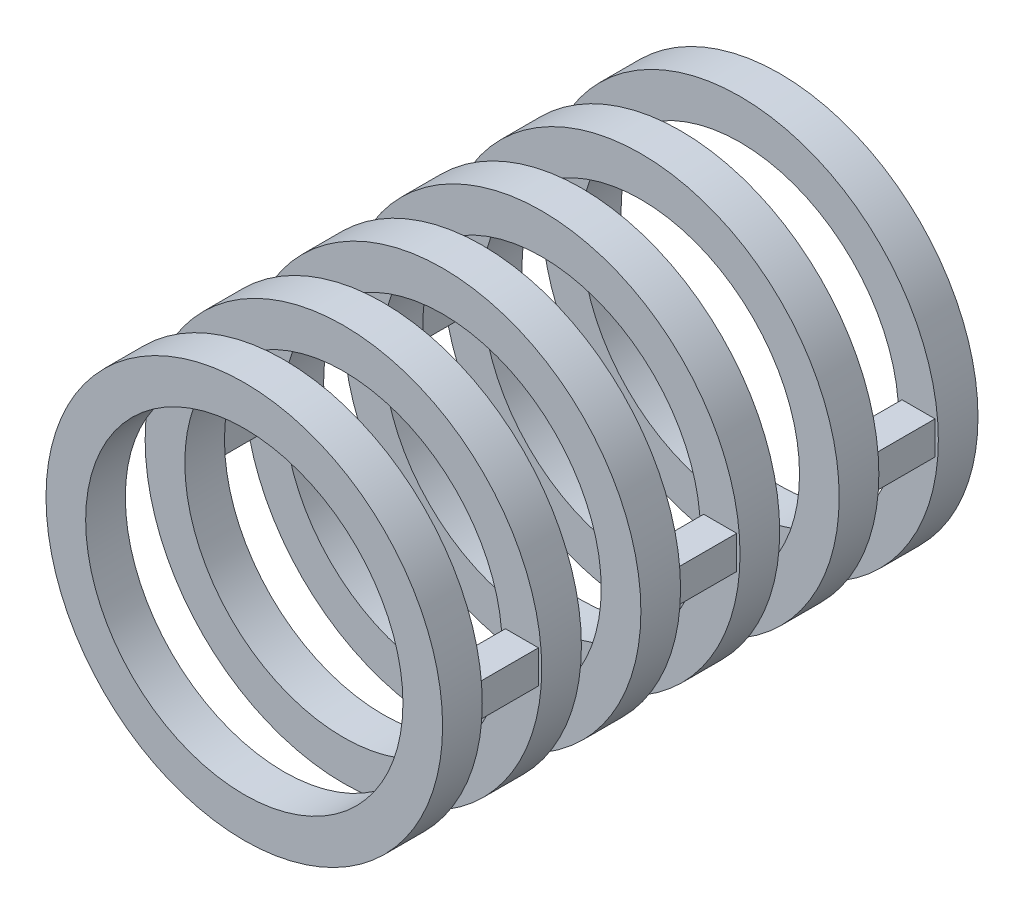
ISO-10303-21;
HEADER;
FILE_DESCRIPTION(('STEP AP214'),'2;1');
FILE_NAME('part.step','',(''),(''),'','','');
FILE_SCHEMA(('AUTOMOTIVE_DESIGN { 1 0 10303 214 1 1 1 1 }'));
ENDSEC;
DATA;
#1=APPLICATION_CONTEXT('core data for automotive mechanical design processes');
#2=APPLICATION_PROTOCOL_DEFINITION('international standard','automotive_design',2000,#1);
#3=PRODUCT_CONTEXT('',#1,'mechanical');
#4=PRODUCT('Part','Part','',(#3));
#5=PRODUCT_RELATED_PRODUCT_CATEGORY('part','',(#4));
#6=PRODUCT_DEFINITION_FORMATION('','',#4);
#7=PRODUCT_DEFINITION_CONTEXT('part definition',#1,'design');
#8=PRODUCT_DEFINITION('design','',#6,#7);
#9=PRODUCT_DEFINITION_SHAPE('','',#8);
#10=(LENGTH_UNIT() NAMED_UNIT(*) SI_UNIT(.MILLI.,.METRE.));
#11=(NAMED_UNIT(*) PLANE_ANGLE_UNIT() SI_UNIT($,.RADIAN.));
#12=(NAMED_UNIT(*) SI_UNIT($,.STERADIAN.) SOLID_ANGLE_UNIT());
#13=UNCERTAINTY_MEASURE_WITH_UNIT(LENGTH_MEASURE(1.E-05),#10,'distance_accuracy_value','');
#14=(GEOMETRIC_REPRESENTATION_CONTEXT(3) GLOBAL_UNCERTAINTY_ASSIGNED_CONTEXT((#13)) GLOBAL_UNIT_ASSIGNED_CONTEXT((#10,
#11,#12)) REPRESENTATION_CONTEXT('',''));
#15=CARTESIAN_POINT('',(0.,0.,0.));
#16=DIRECTION('',(0.,0.,1.));
#17=DIRECTION('',(1.,0.,0.));
#18=AXIS2_PLACEMENT_3D('',#15,#16,#17);
#19=CARTESIAN_POINT('',(0.,0.,15.));
#20=DIRECTION('',(0.,0.,1.));
#21=DIRECTION('',(1.,0.,0.));
#22=AXIS2_PLACEMENT_3D('',#19,#20,#21);
#23=PLANE('',#22);
#24=CARTESIAN_POINT('',(0.,0.,15.));
#25=DIRECTION('',(0.,0.,1.));
#26=DIRECTION('',(1.,0.,0.));
#27=AXIS2_PLACEMENT_3D('',#24,#25,#26);
#28=CIRCLE('',#27,4.8);
#29=CARTESIAN_POINT('',(4.8,0.,15.));
#30=VERTEX_POINT('',#29);
#31=EDGE_CURVE('E391',#30,#30,#28,.T.);
#32=ORIENTED_EDGE('',*,*,#31,.T.);
#33=EDGE_LOOP('',(#32));
#34=FACE_BOUND('',#33,.T.);
#35=CARTESIAN_POINT('',(0.,0.,15.));
#36=DIRECTION('',(0.,0.,1.));
#37=DIRECTION('',(1.,0.,0.));
#38=AXIS2_PLACEMENT_3D('',#35,#36,#37);
#39=CIRCLE('',#38,6.);
#40=CARTESIAN_POINT('',(6.,0.,15.));
#41=VERTEX_POINT('',#40);
#42=EDGE_CURVE('E43',#41,#41,#39,.T.);
#43=ORIENTED_EDGE('',*,*,#42,.F.);
#44=EDGE_LOOP('',(#43));
#45=FACE_BOUND('',#44,.T.);
#46=DIRECTION('',(0.,-1.,0.));
#47=VECTOR('',#46,1.);
#48=CARTESIAN_POINT('',(4.9,0.5,15.));
#49=LINE('',#48,#47);
#50=CARTESIAN_POINT('',(4.9,0.5,15.));
#51=VERTEX_POINT('',#50);
#52=CARTESIAN_POINT('',(4.9,-0.5,15.));
#53=VERTEX_POINT('',#52);
#54=EDGE_CURVE('E54',#51,#53,#49,.T.);
#55=ORIENTED_EDGE('',*,*,#54,.T.);
#56=DIRECTION('',(1.,0.,0.));
#57=VECTOR('',#56,1.);
#58=CARTESIAN_POINT('',(4.9,-0.5,15.));
#59=LINE('',#58,#57);
#60=CARTESIAN_POINT('',(5.9,-0.5,15.));
#61=VERTEX_POINT('',#60);
#62=EDGE_CURVE('E58',#53,#61,#59,.T.);
#63=ORIENTED_EDGE('',*,*,#62,.T.);
#64=DIRECTION('',(0.,1.,0.));
#65=VECTOR('',#64,1.);
#66=CARTESIAN_POINT('',(5.9,-0.5,15.));
#67=LINE('',#66,#65);
#68=CARTESIAN_POINT('',(5.9,0.5,15.));
#69=VERTEX_POINT('',#68);
#70=EDGE_CURVE('E365',#61,#69,#67,.T.);
#71=ORIENTED_EDGE('',*,*,#70,.T.);
#72=DIRECTION('',(-1.,0.,0.));
#73=VECTOR('',#72,1.);
#74=CARTESIAN_POINT('',(5.9,0.5,15.));
#75=LINE('',#74,#73);
#76=EDGE_CURVE('E367',#69,#51,#75,.T.);
#77=ORIENTED_EDGE('',*,*,#76,.T.);
#78=EDGE_LOOP('',(#55,#63,#71,#77));
#79=FACE_BOUND('',#78,.T.);
#80=ADVANCED_FACE('F39',(#34,#45,#79),#23,.F.);
#81=CARTESIAN_POINT('',(0.,0.,16.2));
#82=DIRECTION('',(0.,0.,1.));
#83=DIRECTION('',(1.,0.,0.));
#84=AXIS2_PLACEMENT_3D('',#81,#82,#83);
#85=PLANE('',#84);
#86=CARTESIAN_POINT('',(0.,0.,16.2));
#87=DIRECTION('',(0.,0.,1.));
#88=DIRECTION('',(1.,0.,0.));
#89=AXIS2_PLACEMENT_3D('',#86,#87,#88);
#90=CIRCLE('',#89,6.);
#91=CARTESIAN_POINT('',(6.,0.,16.2));
#92=VERTEX_POINT('',#91);
#93=EDGE_CURVE('E11',#92,#92,#90,.T.);
#94=ORIENTED_EDGE('',*,*,#93,.T.);
#95=EDGE_LOOP('',(#94));
#96=FACE_BOUND('',#95,.T.);
#97=CARTESIAN_POINT('',(0.,0.,16.2));
#98=DIRECTION('',(0.,0.,1.));
#99=DIRECTION('',(1.,0.,0.));
#100=AXIS2_PLACEMENT_3D('',#97,#98,#99);
#101=CIRCLE('',#100,4.8);
#102=CARTESIAN_POINT('',(4.8,0.,16.2));
#103=VERTEX_POINT('',#102);
#104=EDGE_CURVE('E392',#103,#103,#101,.T.);
#105=ORIENTED_EDGE('',*,*,#104,.F.);
#106=EDGE_LOOP('',(#105));
#107=FACE_BOUND('',#106,.T.);
#108=ADVANCED_FACE('F413',(#96,#107),#85,.T.);
#109=CARTESIAN_POINT('',(0.,0.,16.2));
#110=DIRECTION('',(0.,0.,-1.));
#111=DIRECTION('',(-1.,0.,0.));
#112=AXIS2_PLACEMENT_3D('',#109,#110,#111);
#113=CYLINDRICAL_SURFACE('',#112,6.);
#114=ORIENTED_EDGE('',*,*,#93,.F.);
#115=EDGE_LOOP('',(#114));
#116=FACE_BOUND('',#115,.T.);
#117=ORIENTED_EDGE('',*,*,#42,.T.);
#118=EDGE_LOOP('',(#117));
#119=FACE_BOUND('',#118,.T.);
#120=ADVANCED_FACE('F41',(#116,#119),#113,.T.);
#121=CARTESIAN_POINT('',(0.,0.,16.2));
#122=DIRECTION('',(0.,0.,-1.));
#123=DIRECTION('',(-1.,0.,0.));
#124=AXIS2_PLACEMENT_3D('',#121,#122,#123);
#125=CYLINDRICAL_SURFACE('',#124,4.8);
#126=ORIENTED_EDGE('',*,*,#104,.T.);
#127=EDGE_LOOP('',(#126));
#128=FACE_BOUND('',#127,.T.);
#129=ORIENTED_EDGE('',*,*,#31,.F.);
#130=EDGE_LOOP('',(#129));
#131=FACE_BOUND('',#130,.T.);
#132=ADVANCED_FACE('F400',(#128,#131),#125,.F.);
#133=CARTESIAN_POINT('',(4.9,0.5,15.));
#134=DIRECTION('',(1.,0.,0.));
#135=DIRECTION('',(0.,0.,-1.));
#136=AXIS2_PLACEMENT_3D('',#133,#134,#135);
#137=PLANE('',#136);
#138=DIRECTION('',(0.,-1.,0.));
#139=VECTOR('',#138,1.);
#140=CARTESIAN_POINT('',(4.9,0.5,13.2));
#141=LINE('',#140,#139);
#142=CARTESIAN_POINT('',(4.9,0.5,13.2));
#143=VERTEX_POINT('',#142);
#144=CARTESIAN_POINT('',(4.9,-0.5,13.2));
#145=VERTEX_POINT('',#144);
#146=EDGE_CURVE('E359',#143,#145,#141,.T.);
#147=ORIENTED_EDGE('',*,*,#146,.T.);
#148=DIRECTION('',(0.,0.,-1.));
#149=VECTOR('',#148,1.);
#150=CARTESIAN_POINT('',(4.9,-0.5,15.));
#151=LINE('',#150,#149);
#152=EDGE_CURVE('E388',#53,#145,#151,.T.);
#153=ORIENTED_EDGE('',*,*,#152,.F.);
#154=ORIENTED_EDGE('',*,*,#54,.F.);
#155=DIRECTION('',(0.,0.,-1.));
#156=VECTOR('',#155,1.);
#157=CARTESIAN_POINT('',(4.9,0.5,15.));
#158=LINE('',#157,#156);
#159=EDGE_CURVE('E369',#51,#143,#158,.T.);
#160=ORIENTED_EDGE('',*,*,#159,.T.);
#161=EDGE_LOOP('',(#147,#153,#154,#160));
#162=FACE_BOUND('',#161,.T.);
#163=ADVANCED_FACE('F402',(#162),#137,.F.);
#164=CARTESIAN_POINT('',(4.9,-0.5,15.));
#165=DIRECTION('',(0.,1.,0.));
#166=DIRECTION('',(0.,0.,1.));
#167=AXIS2_PLACEMENT_3D('',#164,#165,#166);
#168=PLANE('',#167);
#169=DIRECTION('',(1.,0.,0.));
#170=VECTOR('',#169,1.);
#171=CARTESIAN_POINT('',(4.9,-0.5,13.2));
#172=LINE('',#171,#170);
#173=CARTESIAN_POINT('',(5.9,-0.5,13.2));
#174=VERTEX_POINT('',#173);
#175=EDGE_CURVE('E372',#145,#174,#172,.T.);
#176=ORIENTED_EDGE('',*,*,#175,.T.);
#177=DIRECTION('',(0.,0.,-1.));
#178=VECTOR('',#177,1.);
#179=CARTESIAN_POINT('',(5.9,-0.5,15.));
#180=LINE('',#179,#178);
#181=EDGE_CURVE('E385',#61,#174,#180,.T.);
#182=ORIENTED_EDGE('',*,*,#181,.F.);
#183=ORIENTED_EDGE('',*,*,#62,.F.);
#184=ORIENTED_EDGE('',*,*,#152,.T.);
#185=EDGE_LOOP('',(#176,#182,#183,#184));
#186=FACE_BOUND('',#185,.T.);
#187=ADVANCED_FACE('F410',(#186),#168,.F.);
#188=CARTESIAN_POINT('',(5.9,-0.5,15.));
#189=DIRECTION('',(-1.,0.,0.));
#190=DIRECTION('',(0.,0.,1.));
#191=AXIS2_PLACEMENT_3D('',#188,#189,#190);
#192=PLANE('',#191);
#193=DIRECTION('',(0.,1.,0.));
#194=VECTOR('',#193,1.);
#195=CARTESIAN_POINT('',(5.9,-0.5,13.2));
#196=LINE('',#195,#194);
#197=CARTESIAN_POINT('',(5.9,0.5,13.2));
#198=VERTEX_POINT('',#197);
#199=EDGE_CURVE('E375',#174,#198,#196,.T.);
#200=ORIENTED_EDGE('',*,*,#199,.T.);
#201=DIRECTION('',(0.,0.,-1.));
#202=VECTOR('',#201,1.);
#203=CARTESIAN_POINT('',(5.9,0.5,15.));
#204=LINE('',#203,#202);
#205=EDGE_CURVE('E382',#69,#198,#204,.T.);
#206=ORIENTED_EDGE('',*,*,#205,.F.);
#207=ORIENTED_EDGE('',*,*,#70,.F.);
#208=ORIENTED_EDGE('',*,*,#181,.T.);
#209=EDGE_LOOP('',(#200,#206,#207,#208));
#210=FACE_BOUND('',#209,.T.);
#211=ADVANCED_FACE('F797',(#210),#192,.F.);
#212=CARTESIAN_POINT('',(5.9,0.5,15.));
#213=DIRECTION('',(0.,-1.,0.));
#214=DIRECTION('',(0.,0.,-1.));
#215=AXIS2_PLACEMENT_3D('',#212,#213,#214);
#216=PLANE('',#215);
#217=DIRECTION('',(-1.,0.,0.));
#218=VECTOR('',#217,1.);
#219=CARTESIAN_POINT('',(5.9,0.5,13.2));
#220=LINE('',#219,#218);
#221=EDGE_CURVE('E363',#198,#143,#220,.T.);
#222=ORIENTED_EDGE('',*,*,#221,.T.);
#223=ORIENTED_EDGE('',*,*,#159,.F.);
#224=ORIENTED_EDGE('',*,*,#76,.F.);
#225=ORIENTED_EDGE('',*,*,#205,.T.);
#226=EDGE_LOOP('',(#222,#223,#224,#225));
#227=FACE_BOUND('',#226,.T.);
#228=ADVANCED_FACE('F453',(#227),#216,.F.);
#229=CARTESIAN_POINT('',(0.,0.,13.2));
#230=DIRECTION('',(0.,0.,1.));
#231=DIRECTION('',(1.,0.,0.));
#232=AXIS2_PLACEMENT_3D('',#229,#230,#231);
#233=PLANE('',#232);
#234=CARTESIAN_POINT('',(0.,0.,13.2));
#235=DIRECTION('',(0.,0.,1.));
#236=DIRECTION('',(1.,0.,0.));
#237=AXIS2_PLACEMENT_3D('',#234,#235,#236);
#238=CIRCLE('',#237,4.8);
#239=CARTESIAN_POINT('',(4.8,0.,13.2));
#240=VERTEX_POINT('',#239);
#241=EDGE_CURVE('E350',#240,#240,#238,.T.);
#242=ORIENTED_EDGE('',*,*,#241,.F.);
#243=EDGE_LOOP('',(#242));
#244=FACE_BOUND('',#243,.T.);
#245=CARTESIAN_POINT('',(0.,0.,13.2));
#246=DIRECTION('',(0.,0.,1.));
#247=DIRECTION('',(1.,0.,0.));
#248=AXIS2_PLACEMENT_3D('',#245,#246,#247);
#249=CIRCLE('',#248,6.);
#250=CARTESIAN_POINT('',(6.,0.,13.2));
#251=VERTEX_POINT('',#250);
#252=EDGE_CURVE('E356',#251,#251,#249,.T.);
#253=ORIENTED_EDGE('',*,*,#252,.T.);
#254=EDGE_LOOP('',(#253));
#255=FACE_BOUND('',#254,.T.);
#256=ORIENTED_EDGE('',*,*,#146,.F.);
#257=ORIENTED_EDGE('',*,*,#221,.F.);
#258=ORIENTED_EDGE('',*,*,#199,.F.);
#259=ORIENTED_EDGE('',*,*,#175,.F.);
#260=EDGE_LOOP('',(#256,#257,#258,#259));
#261=FACE_BOUND('',#260,.T.);
#262=ADVANCED_FACE('F447',(#244,#255,#261),#233,.T.);
#263=CARTESIAN_POINT('',(0.,0.,12.));
#264=DIRECTION('',(0.,0.,1.));
#265=DIRECTION('',(1.,0.,0.));
#266=AXIS2_PLACEMENT_3D('',#263,#264,#265);
#267=PLANE('',#266);
#268=CARTESIAN_POINT('',(0.,0.,12.));
#269=DIRECTION('',(0.,0.,1.));
#270=DIRECTION('',(1.,0.,0.));
#271=AXIS2_PLACEMENT_3D('',#268,#269,#270);
#272=CIRCLE('',#271,4.8);
#273=CARTESIAN_POINT('',(4.8,0.,12.));
#274=VERTEX_POINT('',#273);
#275=EDGE_CURVE('E349',#274,#274,#272,.T.);
#276=ORIENTED_EDGE('',*,*,#275,.T.);
#277=EDGE_LOOP('',(#276));
#278=FACE_BOUND('',#277,.T.);
#279=CARTESIAN_POINT('',(0.,0.,12.));
#280=DIRECTION('',(0.,0.,1.));
#281=DIRECTION('',(1.,0.,0.));
#282=AXIS2_PLACEMENT_3D('',#279,#280,#281);
#283=CIRCLE('',#282,6.);
#284=CARTESIAN_POINT('',(6.,0.,12.));
#285=VERTEX_POINT('',#284);
#286=EDGE_CURVE('E353',#285,#285,#283,.T.);
#287=ORIENTED_EDGE('',*,*,#286,.F.);
#288=EDGE_LOOP('',(#287));
#289=FACE_BOUND('',#288,.T.);
#290=DIRECTION('',(0.,1.,0.));
#291=VECTOR('',#290,1.);
#292=CARTESIAN_POINT('',(-4.9,-0.499999999999999,12.));
#293=LINE('',#292,#291);
#294=CARTESIAN_POINT('',(-4.9,-0.499999999999999,12.));
#295=VERTEX_POINT('',#294);
#296=CARTESIAN_POINT('',(-4.9,0.500000000000001,12.));
#297=VERTEX_POINT('',#296);
#298=EDGE_CURVE('E318',#295,#297,#293,.T.);
#299=ORIENTED_EDGE('',*,*,#298,.T.);
#300=DIRECTION('',(-1.,0.,0.));
#301=VECTOR('',#300,1.);
#302=CARTESIAN_POINT('',(-4.9,0.500000000000001,12.));
#303=LINE('',#302,#301);
#304=CARTESIAN_POINT('',(-5.9,0.500000000000001,12.));
#305=VERTEX_POINT('',#304);
#306=EDGE_CURVE('E320',#297,#305,#303,.T.);
#307=ORIENTED_EDGE('',*,*,#306,.T.);
#308=DIRECTION('',(0.,-1.,0.));
#309=VECTOR('',#308,1.);
#310=CARTESIAN_POINT('',(-5.9,0.500000000000001,12.));
#311=LINE('',#310,#309);
#312=CARTESIAN_POINT('',(-5.9,-0.499999999999999,12.));
#313=VERTEX_POINT('',#312);
#314=EDGE_CURVE('E323',#305,#313,#311,.T.);
#315=ORIENTED_EDGE('',*,*,#314,.T.);
#316=DIRECTION('',(1.,0.,0.));
#317=VECTOR('',#316,1.);
#318=CARTESIAN_POINT('',(-5.9,-0.499999999999999,12.));
#319=LINE('',#318,#317);
#320=EDGE_CURVE('E325',#313,#295,#319,.T.);
#321=ORIENTED_EDGE('',*,*,#320,.T.);
#322=EDGE_LOOP('',(#299,#307,#315,#321));
#323=FACE_BOUND('',#322,.T.);
#324=ADVANCED_FACE('F452',(#278,#289,#323),#267,.F.);
#325=CARTESIAN_POINT('',(0.,0.,13.2));
#326=DIRECTION('',(0.,0.,-1.));
#327=DIRECTION('',(-1.,0.,0.));
#328=AXIS2_PLACEMENT_3D('',#325,#326,#327);
#329=CYLINDRICAL_SURFACE('',#328,6.);
#330=ORIENTED_EDGE('',*,*,#252,.F.);
#331=EDGE_LOOP('',(#330));
#332=FACE_BOUND('',#331,.T.);
#333=ORIENTED_EDGE('',*,*,#286,.T.);
#334=EDGE_LOOP('',(#333));
#335=FACE_BOUND('',#334,.T.);
#336=ADVANCED_FACE('F464',(#332,#335),#329,.T.);
#337=CARTESIAN_POINT('',(0.,0.,13.2));
#338=DIRECTION('',(0.,0.,-1.));
#339=DIRECTION('',(-1.,0.,0.));
#340=AXIS2_PLACEMENT_3D('',#337,#338,#339);
#341=CYLINDRICAL_SURFACE('',#340,4.8);
#342=ORIENTED_EDGE('',*,*,#241,.T.);
#343=EDGE_LOOP('',(#342));
#344=FACE_BOUND('',#343,.T.);
#345=ORIENTED_EDGE('',*,*,#275,.F.);
#346=EDGE_LOOP('',(#345));
#347=FACE_BOUND('',#346,.T.);
#348=ADVANCED_FACE('F474',(#344,#347),#341,.F.);
#349=CARTESIAN_POINT('',(-4.9,-0.499999999999999,12.));
#350=DIRECTION('',(-1.,0.,0.));
#351=DIRECTION('',(0.,0.,1.));
#352=AXIS2_PLACEMENT_3D('',#349,#350,#351);
#353=PLANE('',#352);
#354=DIRECTION('',(0.,1.,0.));
#355=VECTOR('',#354,1.);
#356=CARTESIAN_POINT('',(-4.9,-0.499999999999999,10.2));
#357=LINE('',#356,#355);
#358=CARTESIAN_POINT('',(-4.9,-0.499999999999999,10.2));
#359=VERTEX_POINT('',#358);
#360=CARTESIAN_POINT('',(-4.9,0.500000000000001,10.2));
#361=VERTEX_POINT('',#360);
#362=EDGE_CURVE('E315',#359,#361,#357,.T.);
#363=ORIENTED_EDGE('',*,*,#362,.T.);
#364=DIRECTION('',(0.,0.,-1.));
#365=VECTOR('',#364,1.);
#366=CARTESIAN_POINT('',(-4.9,0.500000000000001,12.));
#367=LINE('',#366,#365);
#368=EDGE_CURVE('E346',#297,#361,#367,.T.);
#369=ORIENTED_EDGE('',*,*,#368,.F.);
#370=ORIENTED_EDGE('',*,*,#298,.F.);
#371=DIRECTION('',(0.,0.,-1.));
#372=VECTOR('',#371,1.);
#373=CARTESIAN_POINT('',(-4.9,-0.499999999999999,12.));
#374=LINE('',#373,#372);
#375=EDGE_CURVE('E327',#295,#359,#374,.T.);
#376=ORIENTED_EDGE('',*,*,#375,.T.);
#377=EDGE_LOOP('',(#363,#369,#370,#376));
#378=FACE_BOUND('',#377,.T.);
#379=ADVANCED_FACE('F483',(#378),#353,.F.);
#380=CARTESIAN_POINT('',(-4.9,0.500000000000001,12.));
#381=DIRECTION('',(0.,-1.,0.));
#382=DIRECTION('',(1.,0.,0.));
#383=AXIS2_PLACEMENT_3D('',#380,#381,#382);
#384=PLANE('',#383);
#385=DIRECTION('',(-1.,0.,0.));
#386=VECTOR('',#385,1.);
#387=CARTESIAN_POINT('',(-4.9,0.500000000000001,10.2));
#388=LINE('',#387,#386);
#389=CARTESIAN_POINT('',(-5.9,0.500000000000001,10.2));
#390=VERTEX_POINT('',#389);
#391=EDGE_CURVE('E330',#361,#390,#388,.T.);
#392=ORIENTED_EDGE('',*,*,#391,.T.);
#393=DIRECTION('',(0.,0.,-1.));
#394=VECTOR('',#393,1.);
#395=CARTESIAN_POINT('',(-5.9,0.500000000000001,12.));
#396=LINE('',#395,#394);
#397=EDGE_CURVE('E343',#305,#390,#396,.T.);
#398=ORIENTED_EDGE('',*,*,#397,.F.);
#399=ORIENTED_EDGE('',*,*,#306,.F.);
#400=ORIENTED_EDGE('',*,*,#368,.T.);
#401=EDGE_LOOP('',(#392,#398,#399,#400));
#402=FACE_BOUND('',#401,.T.);
#403=ADVANCED_FACE('F492',(#402),#384,.F.);
#404=CARTESIAN_POINT('',(-5.9,0.500000000000001,12.));
#405=DIRECTION('',(1.,0.,0.));
#406=DIRECTION('',(0.,0.,-1.));
#407=AXIS2_PLACEMENT_3D('',#404,#405,#406);
#408=PLANE('',#407);
#409=DIRECTION('',(0.,-1.,0.));
#410=VECTOR('',#409,1.);
#411=CARTESIAN_POINT('',(-5.9,0.500000000000001,10.2));
#412=LINE('',#411,#410);
#413=CARTESIAN_POINT('',(-5.9,-0.499999999999999,10.2));
#414=VERTEX_POINT('',#413);
#415=EDGE_CURVE('E333',#390,#414,#412,.T.);
#416=ORIENTED_EDGE('',*,*,#415,.T.);
#417=DIRECTION('',(0.,0.,-1.));
#418=VECTOR('',#417,1.);
#419=CARTESIAN_POINT('',(-5.9,-0.499999999999999,12.));
#420=LINE('',#419,#418);
#421=EDGE_CURVE('E340',#313,#414,#420,.T.);
#422=ORIENTED_EDGE('',*,*,#421,.F.);
#423=ORIENTED_EDGE('',*,*,#314,.F.);
#424=ORIENTED_EDGE('',*,*,#397,.T.);
#425=EDGE_LOOP('',(#416,#422,#423,#424));
#426=FACE_BOUND('',#425,.T.);
#427=ADVANCED_FACE('F501',(#426),#408,.F.);
#428=CARTESIAN_POINT('',(-5.9,-0.499999999999999,12.));
#429=DIRECTION('',(0.,1.,0.));
#430=DIRECTION('',(-1.,0.,0.));
#431=AXIS2_PLACEMENT_3D('',#428,#429,#430);
#432=PLANE('',#431);
#433=DIRECTION('',(1.,0.,0.));
#434=VECTOR('',#433,1.);
#435=CARTESIAN_POINT('',(-5.9,-0.499999999999999,10.2));
#436=LINE('',#435,#434);
#437=EDGE_CURVE('E321',#414,#359,#436,.T.);
#438=ORIENTED_EDGE('',*,*,#437,.T.);
#439=ORIENTED_EDGE('',*,*,#375,.F.);
#440=ORIENTED_EDGE('',*,*,#320,.F.);
#441=ORIENTED_EDGE('',*,*,#421,.T.);
#442=EDGE_LOOP('',(#438,#439,#440,#441));
#443=FACE_BOUND('',#442,.T.);
#444=ADVANCED_FACE('F510',(#443),#432,.F.);
#445=CARTESIAN_POINT('',(0.,0.,10.2));
#446=DIRECTION('',(0.,0.,1.));
#447=DIRECTION('',(1.,0.,0.));
#448=AXIS2_PLACEMENT_3D('',#445,#446,#447);
#449=PLANE('',#448);
#450=CARTESIAN_POINT('',(0.,0.,10.2));
#451=DIRECTION('',(0.,0.,1.));
#452=DIRECTION('',(1.,0.,0.));
#453=AXIS2_PLACEMENT_3D('',#450,#451,#452);
#454=CIRCLE('',#453,4.8);
#455=CARTESIAN_POINT('',(4.8,0.,10.2));
#456=VERTEX_POINT('',#455);
#457=EDGE_CURVE('E306',#456,#456,#454,.T.);
#458=ORIENTED_EDGE('',*,*,#457,.F.);
#459=EDGE_LOOP('',(#458));
#460=FACE_BOUND('',#459,.T.);
#461=CARTESIAN_POINT('',(0.,0.,10.2));
#462=DIRECTION('',(0.,0.,1.));
#463=DIRECTION('',(1.,0.,0.));
#464=AXIS2_PLACEMENT_3D('',#461,#462,#463);
#465=CIRCLE('',#464,6.);
#466=CARTESIAN_POINT('',(6.,0.,10.2));
#467=VERTEX_POINT('',#466);
#468=EDGE_CURVE('E312',#467,#467,#465,.T.);
#469=ORIENTED_EDGE('',*,*,#468,.T.);
#470=EDGE_LOOP('',(#469));
#471=FACE_BOUND('',#470,.T.);
#472=ORIENTED_EDGE('',*,*,#362,.F.);
#473=ORIENTED_EDGE('',*,*,#437,.F.);
#474=ORIENTED_EDGE('',*,*,#415,.F.);
#475=ORIENTED_EDGE('',*,*,#391,.F.);
#476=EDGE_LOOP('',(#472,#473,#474,#475));
#477=FACE_BOUND('',#476,.T.);
#478=ADVANCED_FACE('F519',(#460,#471,#477),#449,.T.);
#479=CARTESIAN_POINT('',(0.,0.,9.));
#480=DIRECTION('',(0.,0.,1.));
#481=DIRECTION('',(1.,0.,0.));
#482=AXIS2_PLACEMENT_3D('',#479,#480,#481);
#483=PLANE('',#482);
#484=CARTESIAN_POINT('',(0.,0.,9.));
#485=DIRECTION('',(0.,0.,1.));
#486=DIRECTION('',(1.,0.,0.));
#487=AXIS2_PLACEMENT_3D('',#484,#485,#486);
#488=CIRCLE('',#487,4.8);
#489=CARTESIAN_POINT('',(4.8,0.,9.));
#490=VERTEX_POINT('',#489);
#491=EDGE_CURVE('E305',#490,#490,#488,.T.);
#492=ORIENTED_EDGE('',*,*,#491,.T.);
#493=EDGE_LOOP('',(#492));
#494=FACE_BOUND('',#493,.T.);
#495=CARTESIAN_POINT('',(0.,0.,9.));
#496=DIRECTION('',(0.,0.,1.));
#497=DIRECTION('',(1.,0.,0.));
#498=AXIS2_PLACEMENT_3D('',#495,#496,#497);
#499=CIRCLE('',#498,6.);
#500=CARTESIAN_POINT('',(6.,0.,9.));
#501=VERTEX_POINT('',#500);
#502=EDGE_CURVE('E309',#501,#501,#499,.T.);
#503=ORIENTED_EDGE('',*,*,#502,.F.);
#504=EDGE_LOOP('',(#503));
#505=FACE_BOUND('',#504,.T.);
#506=DIRECTION('',(0.,-1.,0.));
#507=VECTOR('',#506,1.);
#508=CARTESIAN_POINT('',(4.9,0.5,9.));
#509=LINE('',#508,#507);
#510=CARTESIAN_POINT('',(4.9,0.5,9.));
#511=VERTEX_POINT('',#510);
#512=CARTESIAN_POINT('',(4.9,-0.5,9.));
#513=VERTEX_POINT('',#512);
#514=EDGE_CURVE('E274',#511,#513,#509,.T.);
#515=ORIENTED_EDGE('',*,*,#514,.T.);
#516=DIRECTION('',(1.,0.,0.));
#517=VECTOR('',#516,1.);
#518=CARTESIAN_POINT('',(4.9,-0.5,9.));
#519=LINE('',#518,#517);
#520=CARTESIAN_POINT('',(5.9,-0.5,9.));
#521=VERTEX_POINT('',#520);
#522=EDGE_CURVE('E276',#513,#521,#519,.T.);
#523=ORIENTED_EDGE('',*,*,#522,.T.);
#524=DIRECTION('',(0.,1.,0.));
#525=VECTOR('',#524,1.);
#526=CARTESIAN_POINT('',(5.9,-0.5,9.));
#527=LINE('',#526,#525);
#528=CARTESIAN_POINT('',(5.9,0.5,9.));
#529=VERTEX_POINT('',#528);
#530=EDGE_CURVE('E279',#521,#529,#527,.T.);
#531=ORIENTED_EDGE('',*,*,#530,.T.);
#532=DIRECTION('',(-1.,0.,0.));
#533=VECTOR('',#532,1.);
#534=CARTESIAN_POINT('',(5.9,0.5,9.));
#535=LINE('',#534,#533);
#536=EDGE_CURVE('E281',#529,#511,#535,.T.);
#537=ORIENTED_EDGE('',*,*,#536,.T.);
#538=EDGE_LOOP('',(#515,#523,#531,#537));
#539=FACE_BOUND('',#538,.T.);
#540=ADVANCED_FACE('F528',(#494,#505,#539),#483,.F.);
#541=CARTESIAN_POINT('',(0.,0.,10.2));
#542=DIRECTION('',(0.,0.,-1.));
#543=DIRECTION('',(-1.,0.,0.));
#544=AXIS2_PLACEMENT_3D('',#541,#542,#543);
#545=CYLINDRICAL_SURFACE('',#544,6.);
#546=ORIENTED_EDGE('',*,*,#468,.F.);
#547=EDGE_LOOP('',(#546));
#548=FACE_BOUND('',#547,.T.);
#549=ORIENTED_EDGE('',*,*,#502,.T.);
#550=EDGE_LOOP('',(#549));
#551=FACE_BOUND('',#550,.T.);
#552=ADVANCED_FACE('F537',(#548,#551),#545,.T.);
#553=CARTESIAN_POINT('',(0.,0.,10.2));
#554=DIRECTION('',(0.,0.,-1.));
#555=DIRECTION('',(-1.,0.,0.));
#556=AXIS2_PLACEMENT_3D('',#553,#554,#555);
#557=CYLINDRICAL_SURFACE('',#556,4.8);
#558=ORIENTED_EDGE('',*,*,#457,.T.);
#559=EDGE_LOOP('',(#558));
#560=FACE_BOUND('',#559,.T.);
#561=ORIENTED_EDGE('',*,*,#491,.F.);
#562=EDGE_LOOP('',(#561));
#563=FACE_BOUND('',#562,.T.);
#564=ADVANCED_FACE('F546',(#560,#563),#557,.F.);
#565=CARTESIAN_POINT('',(4.9,0.5,9.));
#566=DIRECTION('',(1.,0.,0.));
#567=DIRECTION('',(0.,0.,-1.));
#568=AXIS2_PLACEMENT_3D('',#565,#566,#567);
#569=PLANE('',#568);
#570=DIRECTION('',(0.,-1.,0.));
#571=VECTOR('',#570,1.);
#572=CARTESIAN_POINT('',(4.9,0.5,7.2));
#573=LINE('',#572,#571);
#574=CARTESIAN_POINT('',(4.9,0.5,7.2));
#575=VERTEX_POINT('',#574);
#576=CARTESIAN_POINT('',(4.9,-0.5,7.2));
#577=VERTEX_POINT('',#576);
#578=EDGE_CURVE('E271',#575,#577,#573,.T.);
#579=ORIENTED_EDGE('',*,*,#578,.T.);
#580=DIRECTION('',(0.,0.,-1.));
#581=VECTOR('',#580,1.);
#582=CARTESIAN_POINT('',(4.9,-0.5,9.));
#583=LINE('',#582,#581);
#584=EDGE_CURVE('E302',#513,#577,#583,.T.);
#585=ORIENTED_EDGE('',*,*,#584,.F.);
#586=ORIENTED_EDGE('',*,*,#514,.F.);
#587=DIRECTION('',(0.,0.,-1.));
#588=VECTOR('',#587,1.);
#589=CARTESIAN_POINT('',(4.9,0.5,9.));
#590=LINE('',#589,#588);
#591=EDGE_CURVE('E283',#511,#575,#590,.T.);
#592=ORIENTED_EDGE('',*,*,#591,.T.);
#593=EDGE_LOOP('',(#579,#585,#586,#592));
#594=FACE_BOUND('',#593,.T.);
#595=ADVANCED_FACE('F556',(#594),#569,.F.);
#596=CARTESIAN_POINT('',(4.9,-0.5,9.));
#597=DIRECTION('',(0.,1.,0.));
#598=DIRECTION('',(0.,0.,1.));
#599=AXIS2_PLACEMENT_3D('',#596,#597,#598);
#600=PLANE('',#599);
#601=DIRECTION('',(1.,0.,0.));
#602=VECTOR('',#601,1.);
#603=CARTESIAN_POINT('',(4.9,-0.5,7.2));
#604=LINE('',#603,#602);
#605=CARTESIAN_POINT('',(5.9,-0.5,7.2));
#606=VERTEX_POINT('',#605);
#607=EDGE_CURVE('E286',#577,#606,#604,.T.);
#608=ORIENTED_EDGE('',*,*,#607,.T.);
#609=DIRECTION('',(0.,0.,-1.));
#610=VECTOR('',#609,1.);
#611=CARTESIAN_POINT('',(5.9,-0.5,9.));
#612=LINE('',#611,#610);
#613=EDGE_CURVE('E299',#521,#606,#612,.T.);
#614=ORIENTED_EDGE('',*,*,#613,.F.);
#615=ORIENTED_EDGE('',*,*,#522,.F.);
#616=ORIENTED_EDGE('',*,*,#584,.T.);
#617=EDGE_LOOP('',(#608,#614,#615,#616));
#618=FACE_BOUND('',#617,.T.);
#619=ADVANCED_FACE('F566',(#618),#600,.F.);
#620=CARTESIAN_POINT('',(5.9,-0.5,9.));
#621=DIRECTION('',(-1.,0.,0.));
#622=DIRECTION('',(0.,0.,1.));
#623=AXIS2_PLACEMENT_3D('',#620,#621,#622);
#624=PLANE('',#623);
#625=DIRECTION('',(0.,1.,0.));
#626=VECTOR('',#625,1.);
#627=CARTESIAN_POINT('',(5.9,-0.5,7.2));
#628=LINE('',#627,#626);
#629=CARTESIAN_POINT('',(5.9,0.5,7.2));
#630=VERTEX_POINT('',#629);
#631=EDGE_CURVE('E289',#606,#630,#628,.T.);
#632=ORIENTED_EDGE('',*,*,#631,.T.);
#633=DIRECTION('',(0.,0.,-1.));
#634=VECTOR('',#633,1.);
#635=CARTESIAN_POINT('',(5.9,0.5,9.));
#636=LINE('',#635,#634);
#637=EDGE_CURVE('E296',#529,#630,#636,.T.);
#638=ORIENTED_EDGE('',*,*,#637,.F.);
#639=ORIENTED_EDGE('',*,*,#530,.F.);
#640=ORIENTED_EDGE('',*,*,#613,.T.);
#641=EDGE_LOOP('',(#632,#638,#639,#640));
#642=FACE_BOUND('',#641,.T.);
#643=ADVANCED_FACE('F576',(#642),#624,.F.);
#644=CARTESIAN_POINT('',(5.9,0.5,9.));
#645=DIRECTION('',(0.,-1.,0.));
#646=DIRECTION('',(0.,0.,-1.));
#647=AXIS2_PLACEMENT_3D('',#644,#645,#646);
#648=PLANE('',#647);
#649=DIRECTION('',(-1.,0.,0.));
#650=VECTOR('',#649,1.);
#651=CARTESIAN_POINT('',(5.9,0.5,7.2));
#652=LINE('',#651,#650);
#653=EDGE_CURVE('E277',#630,#575,#652,.T.);
#654=ORIENTED_EDGE('',*,*,#653,.T.);
#655=ORIENTED_EDGE('',*,*,#591,.F.);
#656=ORIENTED_EDGE('',*,*,#536,.F.);
#657=ORIENTED_EDGE('',*,*,#637,.T.);
#658=EDGE_LOOP('',(#654,#655,#656,#657));
#659=FACE_BOUND('',#658,.T.);
#660=ADVANCED_FACE('F586',(#659),#648,.F.);
#661=CARTESIAN_POINT('',(0.,0.,7.2));
#662=DIRECTION('',(0.,0.,1.));
#663=DIRECTION('',(1.,0.,0.));
#664=AXIS2_PLACEMENT_3D('',#661,#662,#663);
#665=PLANE('',#664);
#666=CARTESIAN_POINT('',(0.,0.,7.2));
#667=DIRECTION('',(0.,0.,1.));
#668=DIRECTION('',(1.,0.,0.));
#669=AXIS2_PLACEMENT_3D('',#666,#667,#668);
#670=CIRCLE('',#669,4.8);
#671=CARTESIAN_POINT('',(4.8,0.,7.2));
#672=VERTEX_POINT('',#671);
#673=EDGE_CURVE('E262',#672,#672,#670,.T.);
#674=ORIENTED_EDGE('',*,*,#673,.F.);
#675=EDGE_LOOP('',(#674));
#676=FACE_BOUND('',#675,.T.);
#677=CARTESIAN_POINT('',(0.,0.,7.2));
#678=DIRECTION('',(0.,0.,1.));
#679=DIRECTION('',(1.,0.,0.));
#680=AXIS2_PLACEMENT_3D('',#677,#678,#679);
#681=CIRCLE('',#680,6.);
#682=CARTESIAN_POINT('',(6.,0.,7.2));
#683=VERTEX_POINT('',#682);
#684=EDGE_CURVE('E268',#683,#683,#681,.T.);
#685=ORIENTED_EDGE('',*,*,#684,.T.);
#686=EDGE_LOOP('',(#685));
#687=FACE_BOUND('',#686,.T.);
#688=ORIENTED_EDGE('',*,*,#578,.F.);
#689=ORIENTED_EDGE('',*,*,#653,.F.);
#690=ORIENTED_EDGE('',*,*,#631,.F.);
#691=ORIENTED_EDGE('',*,*,#607,.F.);
#692=EDGE_LOOP('',(#688,#689,#690,#691));
#693=FACE_BOUND('',#692,.T.);
#694=ADVANCED_FACE('F596',(#676,#687,#693),#665,.T.);
#695=CARTESIAN_POINT('',(0.,0.,6.));
#696=DIRECTION('',(0.,0.,1.));
#697=DIRECTION('',(1.,0.,0.));
#698=AXIS2_PLACEMENT_3D('',#695,#696,#697);
#699=PLANE('',#698);
#700=CARTESIAN_POINT('',(0.,0.,6.));
#701=DIRECTION('',(0.,0.,1.));
#702=DIRECTION('',(1.,0.,0.));
#703=AXIS2_PLACEMENT_3D('',#700,#701,#702);
#704=CIRCLE('',#703,4.8);
#705=CARTESIAN_POINT('',(4.8,0.,6.));
#706=VERTEX_POINT('',#705);
#707=EDGE_CURVE('E261',#706,#706,#704,.T.);
#708=ORIENTED_EDGE('',*,*,#707,.T.);
#709=EDGE_LOOP('',(#708));
#710=FACE_BOUND('',#709,.T.);
#711=CARTESIAN_POINT('',(0.,0.,6.));
#712=DIRECTION('',(0.,0.,1.));
#713=DIRECTION('',(1.,0.,0.));
#714=AXIS2_PLACEMENT_3D('',#711,#712,#713);
#715=CIRCLE('',#714,6.);
#716=CARTESIAN_POINT('',(6.,0.,6.));
#717=VERTEX_POINT('',#716);
#718=EDGE_CURVE('E265',#717,#717,#715,.T.);
#719=ORIENTED_EDGE('',*,*,#718,.F.);
#720=EDGE_LOOP('',(#719));
#721=FACE_BOUND('',#720,.T.);
#722=DIRECTION('',(0.,1.,0.));
#723=VECTOR('',#722,1.);
#724=CARTESIAN_POINT('',(-4.9,-0.499999999999999,6.));
#725=LINE('',#724,#723);
#726=CARTESIAN_POINT('',(-4.9,-0.499999999999999,6.));
#727=VERTEX_POINT('',#726);
#728=CARTESIAN_POINT('',(-4.9,0.500000000000001,6.));
#729=VERTEX_POINT('',#728);
#730=EDGE_CURVE('E230',#727,#729,#725,.T.);
#731=ORIENTED_EDGE('',*,*,#730,.T.);
#732=DIRECTION('',(-1.,0.,0.));
#733=VECTOR('',#732,1.);
#734=CARTESIAN_POINT('',(-4.9,0.500000000000001,6.));
#735=LINE('',#734,#733);
#736=CARTESIAN_POINT('',(-5.9,0.500000000000001,6.));
#737=VERTEX_POINT('',#736);
#738=EDGE_CURVE('E232',#729,#737,#735,.T.);
#739=ORIENTED_EDGE('',*,*,#738,.T.);
#740=DIRECTION('',(0.,-1.,0.));
#741=VECTOR('',#740,1.);
#742=CARTESIAN_POINT('',(-5.9,0.500000000000001,6.));
#743=LINE('',#742,#741);
#744=CARTESIAN_POINT('',(-5.9,-0.499999999999999,6.));
#745=VERTEX_POINT('',#744);
#746=EDGE_CURVE('E235',#737,#745,#743,.T.);
#747=ORIENTED_EDGE('',*,*,#746,.T.);
#748=DIRECTION('',(1.,0.,0.));
#749=VECTOR('',#748,1.);
#750=CARTESIAN_POINT('',(-5.9,-0.499999999999999,6.));
#751=LINE('',#750,#749);
#752=EDGE_CURVE('E237',#745,#727,#751,.T.);
#753=ORIENTED_EDGE('',*,*,#752,.T.);
#754=EDGE_LOOP('',(#731,#739,#747,#753));
#755=FACE_BOUND('',#754,.T.);
#756=ADVANCED_FACE('F606',(#710,#721,#755),#699,.F.);
#757=CARTESIAN_POINT('',(0.,0.,7.2));
#758=DIRECTION('',(0.,0.,-1.));
#759=DIRECTION('',(-1.,0.,0.));
#760=AXIS2_PLACEMENT_3D('',#757,#758,#759);
#761=CYLINDRICAL_SURFACE('',#760,6.);
#762=ORIENTED_EDGE('',*,*,#684,.F.);
#763=EDGE_LOOP('',(#762));
#764=FACE_BOUND('',#763,.T.);
#765=ORIENTED_EDGE('',*,*,#718,.T.);
#766=EDGE_LOOP('',(#765));
#767=FACE_BOUND('',#766,.T.);
#768=ADVANCED_FACE('F616',(#764,#767),#761,.T.);
#769=CARTESIAN_POINT('',(0.,0.,7.2));
#770=DIRECTION('',(0.,0.,-1.));
#771=DIRECTION('',(-1.,0.,0.));
#772=AXIS2_PLACEMENT_3D('',#769,#770,#771);
#773=CYLINDRICAL_SURFACE('',#772,4.8);
#774=ORIENTED_EDGE('',*,*,#673,.T.);
#775=EDGE_LOOP('',(#774));
#776=FACE_BOUND('',#775,.T.);
#777=ORIENTED_EDGE('',*,*,#707,.F.);
#778=EDGE_LOOP('',(#777));
#779=FACE_BOUND('',#778,.T.);
#780=ADVANCED_FACE('F626',(#776,#779),#773,.F.);
#781=CARTESIAN_POINT('',(-4.9,-0.499999999999999,6.));
#782=DIRECTION('',(-1.,0.,0.));
#783=DIRECTION('',(0.,0.,1.));
#784=AXIS2_PLACEMENT_3D('',#781,#782,#783);
#785=PLANE('',#784);
#786=DIRECTION('',(0.,1.,0.));
#787=VECTOR('',#786,1.);
#788=CARTESIAN_POINT('',(-4.9,-0.499999999999999,4.2));
#789=LINE('',#788,#787);
#790=CARTESIAN_POINT('',(-4.9,-0.499999999999999,4.2));
#791=VERTEX_POINT('',#790);
#792=CARTESIAN_POINT('',(-4.9,0.500000000000001,4.2));
#793=VERTEX_POINT('',#792);
#794=EDGE_CURVE('E227',#791,#793,#789,.T.);
#795=ORIENTED_EDGE('',*,*,#794,.T.);
#796=DIRECTION('',(0.,0.,-1.));
#797=VECTOR('',#796,1.);
#798=CARTESIAN_POINT('',(-4.9,0.500000000000001,6.));
#799=LINE('',#798,#797);
#800=EDGE_CURVE('E258',#729,#793,#799,.T.);
#801=ORIENTED_EDGE('',*,*,#800,.F.);
#802=ORIENTED_EDGE('',*,*,#730,.F.);
#803=DIRECTION('',(0.,0.,-1.));
#804=VECTOR('',#803,1.);
#805=CARTESIAN_POINT('',(-4.9,-0.499999999999999,6.));
#806=LINE('',#805,#804);
#807=EDGE_CURVE('E239',#727,#791,#806,.T.);
#808=ORIENTED_EDGE('',*,*,#807,.T.);
#809=EDGE_LOOP('',(#795,#801,#802,#808));
#810=FACE_BOUND('',#809,.T.);
#811=ADVANCED_FACE('F635',(#810),#785,.F.);
#812=CARTESIAN_POINT('',(-4.9,0.500000000000001,6.));
#813=DIRECTION('',(0.,-1.,0.));
#814=DIRECTION('',(1.,0.,0.));
#815=AXIS2_PLACEMENT_3D('',#812,#813,#814);
#816=PLANE('',#815);
#817=DIRECTION('',(-1.,0.,0.));
#818=VECTOR('',#817,1.);
#819=CARTESIAN_POINT('',(-4.9,0.500000000000001,4.2));
#820=LINE('',#819,#818);
#821=CARTESIAN_POINT('',(-5.9,0.500000000000001,4.2));
#822=VERTEX_POINT('',#821);
#823=EDGE_CURVE('E242',#793,#822,#820,.T.);
#824=ORIENTED_EDGE('',*,*,#823,.T.);
#825=DIRECTION('',(0.,0.,-1.));
#826=VECTOR('',#825,1.);
#827=CARTESIAN_POINT('',(-5.9,0.500000000000001,6.));
#828=LINE('',#827,#826);
#829=EDGE_CURVE('E255',#737,#822,#828,.T.);
#830=ORIENTED_EDGE('',*,*,#829,.F.);
#831=ORIENTED_EDGE('',*,*,#738,.F.);
#832=ORIENTED_EDGE('',*,*,#800,.T.);
#833=EDGE_LOOP('',(#824,#830,#831,#832));
#834=FACE_BOUND('',#833,.T.);
#835=ADVANCED_FACE('F644',(#834),#816,.F.);
#836=CARTESIAN_POINT('',(-5.9,0.500000000000001,6.));
#837=DIRECTION('',(1.,0.,0.));
#838=DIRECTION('',(0.,0.,-1.));
#839=AXIS2_PLACEMENT_3D('',#836,#837,#838);
#840=PLANE('',#839);
#841=DIRECTION('',(0.,-1.,0.));
#842=VECTOR('',#841,1.);
#843=CARTESIAN_POINT('',(-5.9,0.500000000000001,4.2));
#844=LINE('',#843,#842);
#845=CARTESIAN_POINT('',(-5.9,-0.499999999999999,4.2));
#846=VERTEX_POINT('',#845);
#847=EDGE_CURVE('E245',#822,#846,#844,.T.);
#848=ORIENTED_EDGE('',*,*,#847,.T.);
#849=DIRECTION('',(0.,0.,-1.));
#850=VECTOR('',#849,1.);
#851=CARTESIAN_POINT('',(-5.9,-0.499999999999999,6.));
#852=LINE('',#851,#850);
#853=EDGE_CURVE('E252',#745,#846,#852,.T.);
#854=ORIENTED_EDGE('',*,*,#853,.F.);
#855=ORIENTED_EDGE('',*,*,#746,.F.);
#856=ORIENTED_EDGE('',*,*,#829,.T.);
#857=EDGE_LOOP('',(#848,#854,#855,#856));
#858=FACE_BOUND('',#857,.T.);
#859=ADVANCED_FACE('F653',(#858),#840,.F.);
#860=CARTESIAN_POINT('',(-5.9,-0.499999999999999,6.));
#861=DIRECTION('',(0.,1.,0.));
#862=DIRECTION('',(-1.,0.,0.));
#863=AXIS2_PLACEMENT_3D('',#860,#861,#862);
#864=PLANE('',#863);
#865=DIRECTION('',(1.,0.,0.));
#866=VECTOR('',#865,1.);
#867=CARTESIAN_POINT('',(-5.9,-0.499999999999999,4.2));
#868=LINE('',#867,#866);
#869=EDGE_CURVE('E233',#846,#791,#868,.T.);
#870=ORIENTED_EDGE('',*,*,#869,.T.);
#871=ORIENTED_EDGE('',*,*,#807,.F.);
#872=ORIENTED_EDGE('',*,*,#752,.F.);
#873=ORIENTED_EDGE('',*,*,#853,.T.);
#874=EDGE_LOOP('',(#870,#871,#872,#873));
#875=FACE_BOUND('',#874,.T.);
#876=ADVANCED_FACE('F662',(#875),#864,.F.);
#877=CARTESIAN_POINT('',(0.,0.,4.2));
#878=DIRECTION('',(0.,0.,1.));
#879=DIRECTION('',(1.,0.,0.));
#880=AXIS2_PLACEMENT_3D('',#877,#878,#879);
#881=PLANE('',#880);
#882=CARTESIAN_POINT('',(0.,0.,4.2));
#883=DIRECTION('',(0.,0.,1.));
#884=DIRECTION('',(1.,0.,0.));
#885=AXIS2_PLACEMENT_3D('',#882,#883,#884);
#886=CIRCLE('',#885,4.8);
#887=CARTESIAN_POINT('',(4.8,0.,4.2));
#888=VERTEX_POINT('',#887);
#889=EDGE_CURVE('E829',#888,#888,#886,.T.);
#890=ORIENTED_EDGE('',*,*,#889,.F.);
#891=EDGE_LOOP('',(#890));
#892=FACE_BOUND('',#891,.T.);
#893=CARTESIAN_POINT('',(0.,0.,4.2));
#894=DIRECTION('',(0.,0.,1.));
#895=DIRECTION('',(1.,0.,0.));
#896=AXIS2_PLACEMENT_3D('',#893,#894,#895);
#897=CIRCLE('',#896,6.);
#898=CARTESIAN_POINT('',(6.,0.,4.2));
#899=VERTEX_POINT('',#898);
#900=EDGE_CURVE('E206',#899,#899,#897,.T.);
#901=ORIENTED_EDGE('',*,*,#900,.T.);
#902=EDGE_LOOP('',(#901));
#903=FACE_BOUND('',#902,.T.);
#904=ORIENTED_EDGE('',*,*,#794,.F.);
#905=ORIENTED_EDGE('',*,*,#869,.F.);
#906=ORIENTED_EDGE('',*,*,#847,.F.);
#907=ORIENTED_EDGE('',*,*,#823,.F.);
#908=EDGE_LOOP('',(#904,#905,#906,#907));
#909=FACE_BOUND('',#908,.T.);
#910=ADVANCED_FACE('F671',(#892,#903,#909),#881,.T.);
#911=CARTESIAN_POINT('',(0.,0.,1.2));
#912=DIRECTION('',(0.,0.,1.));
#913=DIRECTION('',(1.,0.,0.));
#914=AXIS2_PLACEMENT_3D('',#911,#912,#913);
#915=PLANE('',#914);
#916=CARTESIAN_POINT('',(0.,0.,1.2));
#917=DIRECTION('',(0.,0.,1.));
#918=DIRECTION('',(1.,0.,0.));
#919=AXIS2_PLACEMENT_3D('',#916,#917,#918);
#920=CIRCLE('',#919,6.);
#921=CARTESIAN_POINT('',(6.,0.,1.2));
#922=VERTEX_POINT('',#921);
#923=EDGE_CURVE('E224',#922,#922,#920,.T.);
#924=ORIENTED_EDGE('',*,*,#923,.T.);
#925=EDGE_LOOP('',(#924));
#926=FACE_BOUND('',#925,.T.);
#927=CARTESIAN_POINT('',(0.,0.,1.2));
#928=DIRECTION('',(0.,0.,1.));
#929=DIRECTION('',(1.,0.,0.));
#930=AXIS2_PLACEMENT_3D('',#927,#928,#929);
#931=CIRCLE('',#930,4.8);
#932=CARTESIAN_POINT('',(4.8,0.,1.2));
#933=VERTEX_POINT('',#932);
#934=EDGE_CURVE('E218',#933,#933,#931,.T.);
#935=ORIENTED_EDGE('',*,*,#934,.F.);
#936=EDGE_LOOP('',(#935));
#937=FACE_BOUND('',#936,.T.);
#938=DIRECTION('',(1.,0.,0.));
#939=VECTOR('',#938,1.);
#940=CARTESIAN_POINT('',(4.9,-0.5,1.2));
#941=LINE('',#940,#939);
#942=CARTESIAN_POINT('',(4.9,-0.5,1.2));
#943=VERTEX_POINT('',#942);
#944=CARTESIAN_POINT('',(5.9,-0.5,1.2));
#945=VERTEX_POINT('',#944);
#946=EDGE_CURVE('E205',#943,#945,#941,.T.);
#947=ORIENTED_EDGE('',*,*,#946,.F.);
#948=DIRECTION('',(0.,-1.,0.));
#949=VECTOR('',#948,1.);
#950=CARTESIAN_POINT('',(4.9,0.5,1.2));
#951=LINE('',#950,#949);
#952=CARTESIAN_POINT('',(4.9,0.5,1.2));
#953=VERTEX_POINT('',#952);
#954=EDGE_CURVE('E203',#953,#943,#951,.T.);
#955=ORIENTED_EDGE('',*,*,#954,.F.);
#956=DIRECTION('',(-1.,0.,0.));
#957=VECTOR('',#956,1.);
#958=CARTESIAN_POINT('',(5.9,0.5,1.2));
#959=LINE('',#958,#957);
#960=CARTESIAN_POINT('',(5.9,0.5,1.2));
#961=VERTEX_POINT('',#960);
#962=EDGE_CURVE('E186',#961,#953,#959,.T.);
#963=ORIENTED_EDGE('',*,*,#962,.F.);
#964=DIRECTION('',(0.,1.,0.));
#965=VECTOR('',#964,1.);
#966=CARTESIAN_POINT('',(5.9,-0.5,1.2));
#967=LINE('',#966,#965);
#968=EDGE_CURVE('E208',#945,#961,#967,.T.);
#969=ORIENTED_EDGE('',*,*,#968,.F.);
#970=EDGE_LOOP('',(#947,#955,#963,#969));
#971=FACE_BOUND('',#970,.T.);
#972=ADVANCED_FACE('F680',(#926,#937,#971),#915,.T.);
#973=CARTESIAN_POINT('',(0.,0.,0.));
#974=DIRECTION('',(0.,0.,1.));
#975=DIRECTION('',(1.,0.,0.));
#976=AXIS2_PLACEMENT_3D('',#973,#974,#975);
#977=PLANE('',#976);
#978=CARTESIAN_POINT('',(0.,0.,0.));
#979=DIRECTION('',(0.,0.,1.));
#980=DIRECTION('',(1.,0.,0.));
#981=AXIS2_PLACEMENT_3D('',#978,#979,#980);
#982=CIRCLE('',#981,6.);
#983=CARTESIAN_POINT('',(6.,0.,0.));
#984=VERTEX_POINT('',#983);
#985=EDGE_CURVE('E221',#984,#984,#982,.T.);
#986=ORIENTED_EDGE('',*,*,#985,.F.);
#987=EDGE_LOOP('',(#986));
#988=FACE_BOUND('',#987,.T.);
#989=CARTESIAN_POINT('',(0.,0.,0.));
#990=DIRECTION('',(0.,0.,1.));
#991=DIRECTION('',(1.,0.,0.));
#992=AXIS2_PLACEMENT_3D('',#989,#990,#991);
#993=CIRCLE('',#992,4.8);
#994=CARTESIAN_POINT('',(4.8,0.,0.));
#995=VERTEX_POINT('',#994);
#996=EDGE_CURVE('E217',#995,#995,#993,.T.);
#997=ORIENTED_EDGE('',*,*,#996,.T.);
#998=EDGE_LOOP('',(#997));
#999=FACE_BOUND('',#998,.T.);
#1000=ADVANCED_FACE('F690',(#988,#999),#977,.F.);
#1001=CARTESIAN_POINT('',(0.,0.,1.2));
#1002=DIRECTION('',(0.,0.,-1.));
#1003=DIRECTION('',(-1.,0.,0.));
#1004=AXIS2_PLACEMENT_3D('',#1001,#1002,#1003);
#1005=CYLINDRICAL_SURFACE('',#1004,6.);
#1006=ORIENTED_EDGE('',*,*,#923,.F.);
#1007=EDGE_LOOP('',(#1006));
#1008=FACE_BOUND('',#1007,.T.);
#1009=ORIENTED_EDGE('',*,*,#985,.T.);
#1010=EDGE_LOOP('',(#1009));
#1011=FACE_BOUND('',#1010,.T.);
#1012=ADVANCED_FACE('F699',(#1008,#1011),#1005,.T.);
#1013=CARTESIAN_POINT('',(0.,0.,1.2));
#1014=DIRECTION('',(0.,0.,-1.));
#1015=DIRECTION('',(-1.,0.,0.));
#1016=AXIS2_PLACEMENT_3D('',#1013,#1014,#1015);
#1017=CYLINDRICAL_SURFACE('',#1016,4.8);
#1018=ORIENTED_EDGE('',*,*,#934,.T.);
#1019=EDGE_LOOP('',(#1018));
#1020=FACE_BOUND('',#1019,.T.);
#1021=ORIENTED_EDGE('',*,*,#996,.F.);
#1022=EDGE_LOOP('',(#1021));
#1023=FACE_BOUND('',#1022,.T.);
#1024=ADVANCED_FACE('F709',(#1020,#1023),#1017,.F.);
#1025=CARTESIAN_POINT('',(4.9,0.5,3.));
#1026=DIRECTION('',(1.,0.,0.));
#1027=DIRECTION('',(0.,0.,-1.));
#1028=AXIS2_PLACEMENT_3D('',#1025,#1026,#1027);
#1029=PLANE('',#1028);
#1030=ORIENTED_EDGE('',*,*,#954,.T.);
#1031=DIRECTION('',(0.,0.,-1.));
#1032=VECTOR('',#1031,1.);
#1033=CARTESIAN_POINT('',(4.9,-0.5,3.));
#1034=LINE('',#1033,#1032);
#1035=CARTESIAN_POINT('',(4.9,-0.5,3.));
#1036=VERTEX_POINT('',#1035);
#1037=EDGE_CURVE('E181',#1036,#943,#1034,.T.);
#1038=ORIENTED_EDGE('',*,*,#1037,.F.);
#1039=DIRECTION('',(0.,-1.,0.));
#1040=VECTOR('',#1039,1.);
#1041=CARTESIAN_POINT('',(4.9,0.5,3.));
#1042=LINE('',#1041,#1040);
#1043=CARTESIAN_POINT('',(4.9,0.5,3.));
#1044=VERTEX_POINT('',#1043);
#1045=EDGE_CURVE('E175',#1044,#1036,#1042,.T.);
#1046=ORIENTED_EDGE('',*,*,#1045,.F.);
#1047=DIRECTION('',(0.,0.,-1.));
#1048=VECTOR('',#1047,1.);
#1049=CARTESIAN_POINT('',(4.9,0.5,3.));
#1050=LINE('',#1049,#1048);
#1051=EDGE_CURVE('E179',#1044,#953,#1050,.T.);
#1052=ORIENTED_EDGE('',*,*,#1051,.T.);
#1053=EDGE_LOOP('',(#1030,#1038,#1046,#1052));
#1054=FACE_BOUND('',#1053,.T.);
#1055=ADVANCED_FACE('F178',(#1054),#1029,.F.);
#1056=CARTESIAN_POINT('',(4.9,-0.5,3.));
#1057=DIRECTION('',(0.,1.,0.));
#1058=DIRECTION('',(0.,0.,1.));
#1059=AXIS2_PLACEMENT_3D('',#1056,#1057,#1058);
#1060=PLANE('',#1059);
#1061=ORIENTED_EDGE('',*,*,#946,.T.);
#1062=DIRECTION('',(0.,0.,-1.));
#1063=VECTOR('',#1062,1.);
#1064=CARTESIAN_POINT('',(5.9,-0.5,3.));
#1065=LINE('',#1064,#1063);
#1066=CARTESIAN_POINT('',(5.9,-0.5,3.));
#1067=VERTEX_POINT('',#1066);
#1068=EDGE_CURVE('E213',#1067,#945,#1065,.T.);
#1069=ORIENTED_EDGE('',*,*,#1068,.F.);
#1070=DIRECTION('',(1.,0.,0.));
#1071=VECTOR('',#1070,1.);
#1072=CARTESIAN_POINT('',(4.9,-0.5,3.));
#1073=LINE('',#1072,#1071);
#1074=EDGE_CURVE('E185',#1036,#1067,#1073,.T.);
#1075=ORIENTED_EDGE('',*,*,#1074,.F.);
#1076=ORIENTED_EDGE('',*,*,#1037,.T.);
#1077=EDGE_LOOP('',(#1061,#1069,#1075,#1076));
#1078=FACE_BOUND('',#1077,.T.);
#1079=ADVANCED_FACE('F728',(#1078),#1060,.F.);
#1080=CARTESIAN_POINT('',(5.9,-0.5,3.));
#1081=DIRECTION('',(-1.,0.,0.));
#1082=DIRECTION('',(0.,0.,1.));
#1083=AXIS2_PLACEMENT_3D('',#1080,#1081,#1082);
#1084=PLANE('',#1083);
#1085=ORIENTED_EDGE('',*,*,#968,.T.);
#1086=DIRECTION('',(0.,0.,-1.));
#1087=VECTOR('',#1086,1.);
#1088=CARTESIAN_POINT('',(5.9,0.5,3.));
#1089=LINE('',#1088,#1087);
#1090=CARTESIAN_POINT('',(5.9,0.5,3.));
#1091=VERTEX_POINT('',#1090);
#1092=EDGE_CURVE('E194',#1091,#961,#1089,.T.);
#1093=ORIENTED_EDGE('',*,*,#1092,.F.);
#1094=DIRECTION('',(0.,1.,0.));
#1095=VECTOR('',#1094,1.);
#1096=CARTESIAN_POINT('',(5.9,-0.5,3.));
#1097=LINE('',#1096,#1095);
#1098=EDGE_CURVE('E198',#1067,#1091,#1097,.T.);
#1099=ORIENTED_EDGE('',*,*,#1098,.F.);
#1100=ORIENTED_EDGE('',*,*,#1068,.T.);
#1101=EDGE_LOOP('',(#1085,#1093,#1099,#1100));
#1102=FACE_BOUND('',#1101,.T.);
#1103=ADVANCED_FACE('F737',(#1102),#1084,.F.);
#1104=CARTESIAN_POINT('',(5.9,0.5,3.));
#1105=DIRECTION('',(0.,-1.,0.));
#1106=DIRECTION('',(0.,0.,-1.));
#1107=AXIS2_PLACEMENT_3D('',#1104,#1105,#1106);
#1108=PLANE('',#1107);
#1109=ORIENTED_EDGE('',*,*,#962,.T.);
#1110=ORIENTED_EDGE('',*,*,#1051,.F.);
#1111=DIRECTION('',(-1.,0.,0.));
#1112=VECTOR('',#1111,1.);
#1113=CARTESIAN_POINT('',(5.9,0.5,3.));
#1114=LINE('',#1113,#1112);
#1115=EDGE_CURVE('E191',#1091,#1044,#1114,.T.);
#1116=ORIENTED_EDGE('',*,*,#1115,.F.);
#1117=ORIENTED_EDGE('',*,*,#1092,.T.);
#1118=EDGE_LOOP('',(#1109,#1110,#1116,#1117));
#1119=FACE_BOUND('',#1118,.T.);
#1120=ADVANCED_FACE('F190',(#1119),#1108,.F.);
#1121=CARTESIAN_POINT('',(0.,0.,3.));
#1122=DIRECTION('',(0.,0.,1.));
#1123=DIRECTION('',(1.,0.,0.));
#1124=AXIS2_PLACEMENT_3D('',#1121,#1122,#1123);
#1125=PLANE('',#1124);
#1126=CARTESIAN_POINT('',(0.,0.,3.));
#1127=DIRECTION('',(0.,0.,1.));
#1128=DIRECTION('',(1.,0.,0.));
#1129=AXIS2_PLACEMENT_3D('',#1126,#1127,#1128);
#1130=CIRCLE('',#1129,6.);
#1131=CARTESIAN_POINT('',(6.,0.,3.));
#1132=VERTEX_POINT('',#1131);
#1133=EDGE_CURVE('E835',#1132,#1132,#1130,.T.);
#1134=ORIENTED_EDGE('',*,*,#1133,.F.);
#1135=EDGE_LOOP('',(#1134));
#1136=FACE_BOUND('',#1135,.T.);
#1137=CARTESIAN_POINT('',(0.,0.,3.));
#1138=DIRECTION('',(0.,0.,1.));
#1139=DIRECTION('',(1.,0.,0.));
#1140=AXIS2_PLACEMENT_3D('',#1137,#1138,#1139);
#1141=CIRCLE('',#1140,4.8);
#1142=CARTESIAN_POINT('',(4.8,0.,3.));
#1143=VERTEX_POINT('',#1142);
#1144=EDGE_CURVE('E832',#1143,#1143,#1141,.T.);
#1145=ORIENTED_EDGE('',*,*,#1144,.T.);
#1146=EDGE_LOOP('',(#1145));
#1147=FACE_BOUND('',#1146,.T.);
#1148=ORIENTED_EDGE('',*,*,#1115,.T.);
#1149=ORIENTED_EDGE('',*,*,#1045,.T.);
#1150=ORIENTED_EDGE('',*,*,#1074,.T.);
#1151=ORIENTED_EDGE('',*,*,#1098,.T.);
#1152=EDGE_LOOP('',(#1148,#1149,#1150,#1151));
#1153=FACE_BOUND('',#1152,.T.);
#1154=ADVANCED_FACE('F196',(#1136,#1147,#1153),#1125,.F.);
#1155=CARTESIAN_POINT('',(0.,0.,4.2));
#1156=DIRECTION('',(0.,0.,-1.));
#1157=DIRECTION('',(-1.,0.,0.));
#1158=AXIS2_PLACEMENT_3D('',#1155,#1156,#1157);
#1159=CYLINDRICAL_SURFACE('',#1158,6.);
#1160=ORIENTED_EDGE('',*,*,#900,.F.);
#1161=EDGE_LOOP('',(#1160));
#1162=FACE_BOUND('',#1161,.T.);
#1163=ORIENTED_EDGE('',*,*,#1133,.T.);
#1164=EDGE_LOOP('',(#1163));
#1165=FACE_BOUND('',#1164,.T.);
#1166=ADVANCED_FACE('F764',(#1162,#1165),#1159,.T.);
#1167=CARTESIAN_POINT('',(0.,0.,4.2));
#1168=DIRECTION('',(0.,0.,-1.));
#1169=DIRECTION('',(-1.,0.,0.));
#1170=AXIS2_PLACEMENT_3D('',#1167,#1168,#1169);
#1171=CYLINDRICAL_SURFACE('',#1170,4.8);
#1172=ORIENTED_EDGE('',*,*,#889,.T.);
#1173=EDGE_LOOP('',(#1172));
#1174=FACE_BOUND('',#1173,.T.);
#1175=ORIENTED_EDGE('',*,*,#1144,.F.);
#1176=EDGE_LOOP('',(#1175));
#1177=FACE_BOUND('',#1176,.T.);
#1178=ADVANCED_FACE('F774',(#1174,#1177),#1171,.F.);
#1179=CLOSED_SHELL('',(#80,#108,#120,#132,#163,#187,#211,#228,#262,#324,#336,#348,#379,#403,
#427,#444,#478,#540,#552,#564,#595,#619,#643,#660,#694,#756,#768,#780,#811,#835,#859,#876,#910,
#972,#1000,#1012,#1024,#1055,#1079,#1103,#1120,#1154,#1166,#1178));
#1180=MANIFOLD_SOLID_BREP('B2',#1179);
#1181=ADVANCED_BREP_SHAPE_REPRESENTATION('',(#18,#1180),#14);
#1182=SHAPE_DEFINITION_REPRESENTATION(#9,#1181);
ENDSEC;
END-ISO-10303-21;
